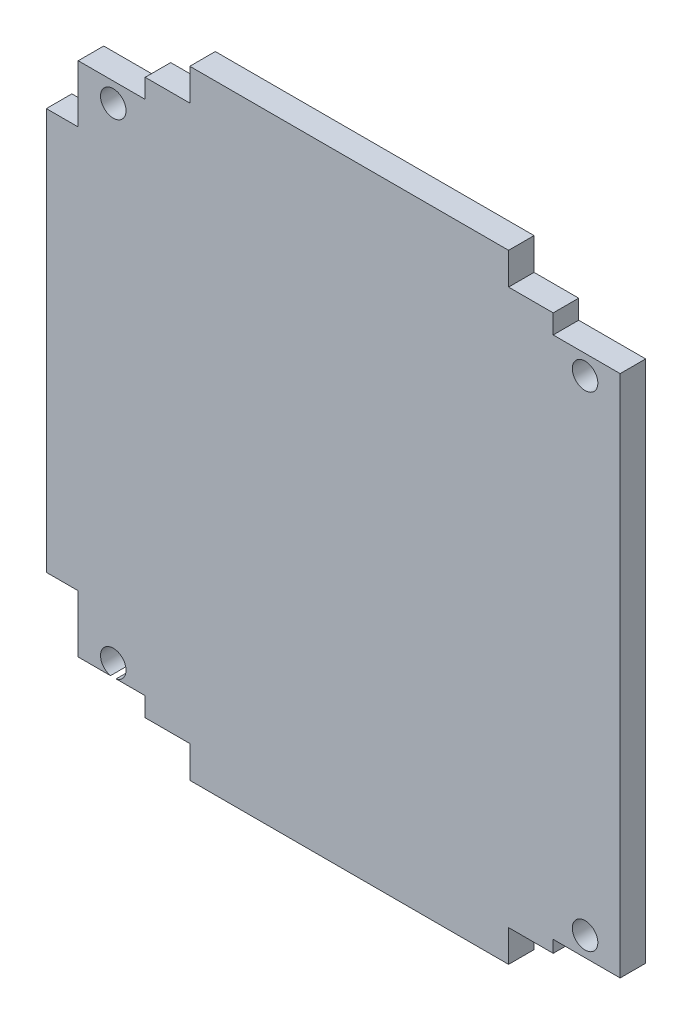
ISO-10303-21;
HEADER;
FILE_DESCRIPTION(('STEP AP214'),'2;1');
FILE_NAME('part.step','',(''),(''),'','','');
FILE_SCHEMA(('AUTOMOTIVE_DESIGN { 1 0 10303 214 1 1 1 1 }'));
ENDSEC;
DATA;
#1=APPLICATION_CONTEXT('core data for automotive mechanical design processes');
#2=APPLICATION_PROTOCOL_DEFINITION('international standard','automotive_design',2000,#1);
#3=PRODUCT_CONTEXT('',#1,'mechanical');
#4=PRODUCT('Part','Part','',(#3));
#5=PRODUCT_RELATED_PRODUCT_CATEGORY('part','',(#4));
#6=PRODUCT_DEFINITION_FORMATION('','',#4);
#7=PRODUCT_DEFINITION_CONTEXT('part definition',#1,'design');
#8=PRODUCT_DEFINITION('design','',#6,#7);
#9=PRODUCT_DEFINITION_SHAPE('','',#8);
#10=(LENGTH_UNIT() NAMED_UNIT(*) SI_UNIT(.MILLI.,.METRE.));
#11=(NAMED_UNIT(*) PLANE_ANGLE_UNIT() SI_UNIT($,.RADIAN.));
#12=(NAMED_UNIT(*) SI_UNIT($,.STERADIAN.) SOLID_ANGLE_UNIT());
#13=UNCERTAINTY_MEASURE_WITH_UNIT(LENGTH_MEASURE(1.E-05),#10,'distance_accuracy_value','');
#14=(GEOMETRIC_REPRESENTATION_CONTEXT(3) GLOBAL_UNCERTAINTY_ASSIGNED_CONTEXT((#13)) GLOBAL_UNIT_ASSIGNED_CONTEXT((#10,
#11,#12)) REPRESENTATION_CONTEXT('',''));
#15=CARTESIAN_POINT('',(0.,0.,0.));
#16=DIRECTION('',(0.,0.,1.));
#17=DIRECTION('',(1.,0.,0.));
#18=AXIS2_PLACEMENT_3D('',#15,#16,#17);
#19=CARTESIAN_POINT('',(-42.5,-39.9510102661599,4.));
#20=DIRECTION('',(0.,1.,0.));
#21=DIRECTION('',(0.,0.,1.));
#22=AXIS2_PLACEMENT_3D('',#19,#20,#21);
#23=PLANE('',#22);
#24=DIRECTION('',(1.,0.,0.));
#25=VECTOR('',#24,1.);
#26=CARTESIAN_POINT('',(-42.5,-39.9510102661599,0.));
#27=LINE('',#26,#25);
#28=CARTESIAN_POINT('',(-42.5,-39.9510102661599,0.));
#29=VERTEX_POINT('',#28);
#30=CARTESIAN_POINT('',(-37.4399268037023,-39.9510102661599,0.));
#31=VERTEX_POINT('',#30);
#32=EDGE_CURVE('E275',#29,#31,#27,.T.);
#33=ORIENTED_EDGE('',*,*,#32,.T.);
#34=DIRECTION('',(0.,0.,1.));
#35=VECTOR('',#34,1.);
#36=CARTESIAN_POINT('',(-37.4399268037023,-39.9510102661599,-6.));
#37=LINE('',#36,#35);
#38=CARTESIAN_POINT('',(-37.4399268037023,-39.9510102661599,4.));
#39=VERTEX_POINT('',#38);
#40=EDGE_CURVE('E54',#31,#39,#37,.T.);
#41=ORIENTED_EDGE('',*,*,#40,.T.);
#42=DIRECTION('',(1.,0.,0.));
#43=VECTOR('',#42,1.);
#44=CARTESIAN_POINT('',(-42.5,-39.9510102661599,4.));
#45=LINE('',#44,#43);
#46=CARTESIAN_POINT('',(-42.5,-39.9510102661599,4.));
#47=VERTEX_POINT('',#46);
#48=EDGE_CURVE('E402',#47,#39,#45,.T.);
#49=ORIENTED_EDGE('',*,*,#48,.F.);
#50=DIRECTION('',(0.,0.,-1.));
#51=VECTOR('',#50,1.);
#52=CARTESIAN_POINT('',(-42.5,-39.9510102661599,4.));
#53=LINE('',#52,#51);
#54=EDGE_CURVE('E316',#47,#29,#53,.T.);
#55=ORIENTED_EDGE('',*,*,#54,.T.);
#56=EDGE_LOOP('',(#33,#41,#49,#55));
#57=FACE_BOUND('',#56,.T.);
#58=ADVANCED_FACE('F39',(#57),#23,.F.);
#59=CARTESIAN_POINT('',(42.5,41.0489897338401,4.));
#60=DIRECTION('',(0.,-1.,0.));
#61=DIRECTION('',(1.,0.,0.));
#62=AXIS2_PLACEMENT_3D('',#59,#60,#61);
#63=PLANE('',#62);
#64=DIRECTION('',(-1.,0.,0.));
#65=VECTOR('',#64,1.);
#66=CARTESIAN_POINT('',(42.5,41.0489897338401,0.));
#67=LINE('',#66,#65);
#68=CARTESIAN_POINT('',(42.5,41.0489897338401,0.));
#69=VERTEX_POINT('',#68);
#70=CARTESIAN_POINT('',(32.,41.0489897338401,0.));
#71=VERTEX_POINT('',#70);
#72=EDGE_CURVE('E245',#69,#71,#67,.T.);
#73=ORIENTED_EDGE('',*,*,#72,.T.);
#74=DIRECTION('',(0.,0.,-1.));
#75=VECTOR('',#74,1.);
#76=CARTESIAN_POINT('',(32.,41.0489897338401,4.));
#77=LINE('',#76,#75);
#78=CARTESIAN_POINT('',(32.,41.0489897338401,4.));
#79=VERTEX_POINT('',#78);
#80=EDGE_CURVE('E48',#79,#71,#77,.T.);
#81=ORIENTED_EDGE('',*,*,#80,.F.);
#82=DIRECTION('',(-1.,0.,0.));
#83=VECTOR('',#82,1.);
#84=CARTESIAN_POINT('',(42.5,41.0489897338401,4.));
#85=LINE('',#84,#83);
#86=CARTESIAN_POINT('',(42.5,41.0489897338401,4.));
#87=VERTEX_POINT('',#86);
#88=EDGE_CURVE('E294',#87,#79,#85,.T.);
#89=ORIENTED_EDGE('',*,*,#88,.F.);
#90=DIRECTION('',(0.,0.,-1.));
#91=VECTOR('',#90,1.);
#92=CARTESIAN_POINT('',(42.5,41.0489897338401,4.));
#93=LINE('',#92,#91);
#94=EDGE_CURVE('E241',#87,#69,#93,.T.);
#95=ORIENTED_EDGE('',*,*,#94,.T.);
#96=EDGE_LOOP('',(#73,#81,#89,#95));
#97=FACE_BOUND('',#96,.T.);
#98=ADVANCED_FACE('F41',(#97),#63,.F.);
#99=CARTESIAN_POINT('',(32.,41.0489897338401,4.));
#100=DIRECTION('',(-1.,0.,0.));
#101=DIRECTION('',(0.,0.,1.));
#102=AXIS2_PLACEMENT_3D('',#99,#100,#101);
#103=PLANE('',#102);
#104=DIRECTION('',(0.,1.,0.));
#105=VECTOR('',#104,1.);
#106=CARTESIAN_POINT('',(32.,41.0489897338401,0.));
#107=LINE('',#106,#105);
#108=CARTESIAN_POINT('',(32.,44.0489897338401,0.));
#109=VERTEX_POINT('',#108);
#110=EDGE_CURVE('E248',#71,#109,#107,.T.);
#111=ORIENTED_EDGE('',*,*,#110,.T.);
#112=DIRECTION('',(0.,0.,-1.));
#113=VECTOR('',#112,1.);
#114=CARTESIAN_POINT('',(32.,44.0489897338401,4.));
#115=LINE('',#114,#113);
#116=CARTESIAN_POINT('',(32.,44.0489897338401,4.));
#117=VERTEX_POINT('',#116);
#118=EDGE_CURVE('E352',#117,#109,#115,.T.);
#119=ORIENTED_EDGE('',*,*,#118,.F.);
#120=DIRECTION('',(0.,1.,0.));
#121=VECTOR('',#120,1.);
#122=CARTESIAN_POINT('',(32.,41.0489897338401,4.));
#123=LINE('',#122,#121);
#124=EDGE_CURVE('E153',#79,#117,#123,.T.);
#125=ORIENTED_EDGE('',*,*,#124,.F.);
#126=ORIENTED_EDGE('',*,*,#80,.T.);
#127=EDGE_LOOP('',(#111,#119,#125,#126));
#128=FACE_BOUND('',#127,.T.);
#129=ADVANCED_FACE('F433',(#128),#103,.F.);
#130=CARTESIAN_POINT('',(25.,44.0489897338401,4.));
#131=DIRECTION('',(0.,-1.,0.));
#132=DIRECTION('',(1.,0.,0.));
#133=AXIS2_PLACEMENT_3D('',#130,#131,#132);
#134=PLANE('',#133);
#135=DIRECTION('',(-1.,0.,0.));
#136=VECTOR('',#135,1.);
#137=CARTESIAN_POINT('',(25.,44.0489897338401,0.));
#138=LINE('',#137,#136);
#139=CARTESIAN_POINT('',(25.,44.0489897338401,0.));
#140=VERTEX_POINT('',#139);
#141=EDGE_CURVE('E250',#109,#140,#138,.T.);
#142=ORIENTED_EDGE('',*,*,#141,.T.);
#143=DIRECTION('',(0.,0.,-1.));
#144=VECTOR('',#143,1.);
#145=CARTESIAN_POINT('',(25.,44.0489897338401,4.));
#146=LINE('',#145,#144);
#147=CARTESIAN_POINT('',(25.,44.0489897338401,4.));
#148=VERTEX_POINT('',#147);
#149=EDGE_CURVE('E349',#148,#140,#146,.T.);
#150=ORIENTED_EDGE('',*,*,#149,.F.);
#151=DIRECTION('',(-1.,0.,0.));
#152=VECTOR('',#151,1.);
#153=CARTESIAN_POINT('',(25.,44.0489897338401,4.));
#154=LINE('',#153,#152);
#155=EDGE_CURVE('E377',#117,#148,#154,.T.);
#156=ORIENTED_EDGE('',*,*,#155,.F.);
#157=ORIENTED_EDGE('',*,*,#118,.T.);
#158=EDGE_LOOP('',(#142,#150,#156,#157));
#159=FACE_BOUND('',#158,.T.);
#160=ADVANCED_FACE('F436',(#159),#134,.F.);
#161=CARTESIAN_POINT('',(25.,49.0489897338401,4.));
#162=DIRECTION('',(-1.,0.,0.));
#163=DIRECTION('',(0.,0.,1.));
#164=AXIS2_PLACEMENT_3D('',#161,#162,#163);
#165=PLANE('',#164);
#166=DIRECTION('',(0.,1.,0.));
#167=VECTOR('',#166,1.);
#168=CARTESIAN_POINT('',(25.,49.0489897338401,0.));
#169=LINE('',#168,#167);
#170=CARTESIAN_POINT('',(25.,49.0489897338401,0.));
#171=VERTEX_POINT('',#170);
#172=EDGE_CURVE('E252',#140,#171,#169,.T.);
#173=ORIENTED_EDGE('',*,*,#172,.T.);
#174=DIRECTION('',(0.,0.,-1.));
#175=VECTOR('',#174,1.);
#176=CARTESIAN_POINT('',(25.,49.0489897338401,4.));
#177=LINE('',#176,#175);
#178=CARTESIAN_POINT('',(25.,49.0489897338401,4.));
#179=VERTEX_POINT('',#178);
#180=EDGE_CURVE('E346',#179,#171,#177,.T.);
#181=ORIENTED_EDGE('',*,*,#180,.F.);
#182=DIRECTION('',(0.,1.,0.));
#183=VECTOR('',#182,1.);
#184=CARTESIAN_POINT('',(25.,49.0489897338401,4.));
#185=LINE('',#184,#183);
#186=EDGE_CURVE('E379',#148,#179,#185,.T.);
#187=ORIENTED_EDGE('',*,*,#186,.F.);
#188=ORIENTED_EDGE('',*,*,#149,.T.);
#189=EDGE_LOOP('',(#173,#181,#187,#188));
#190=FACE_BOUND('',#189,.T.);
#191=ADVANCED_FACE('F441',(#190),#165,.F.);
#192=CARTESIAN_POINT('',(-25.,49.0489897338401,4.));
#193=DIRECTION('',(0.,-1.,0.));
#194=DIRECTION('',(0.,0.,-1.));
#195=AXIS2_PLACEMENT_3D('',#192,#193,#194);
#196=PLANE('',#195);
#197=DIRECTION('',(-1.,0.,0.));
#198=VECTOR('',#197,1.);
#199=CARTESIAN_POINT('',(-25.,49.0489897338401,0.));
#200=LINE('',#199,#198);
#201=CARTESIAN_POINT('',(-25.,49.0489897338401,0.));
#202=VERTEX_POINT('',#201);
#203=EDGE_CURVE('E254',#171,#202,#200,.T.);
#204=ORIENTED_EDGE('',*,*,#203,.T.);
#205=DIRECTION('',(0.,0.,-1.));
#206=VECTOR('',#205,1.);
#207=CARTESIAN_POINT('',(-25.,49.0489897338401,4.));
#208=LINE('',#207,#206);
#209=CARTESIAN_POINT('',(-25.,49.0489897338401,4.));
#210=VERTEX_POINT('',#209);
#211=EDGE_CURVE('E343',#210,#202,#208,.T.);
#212=ORIENTED_EDGE('',*,*,#211,.F.);
#213=DIRECTION('',(-1.,0.,0.));
#214=VECTOR('',#213,1.);
#215=CARTESIAN_POINT('',(-25.,49.0489897338401,4.));
#216=LINE('',#215,#214);
#217=EDGE_CURVE('E381',#179,#210,#216,.T.);
#218=ORIENTED_EDGE('',*,*,#217,.F.);
#219=ORIENTED_EDGE('',*,*,#180,.T.);
#220=EDGE_LOOP('',(#204,#212,#218,#219));
#221=FACE_BOUND('',#220,.T.);
#222=ADVANCED_FACE('F447',(#221),#196,.F.);
#223=CARTESIAN_POINT('',(-25.,44.0489897338401,4.));
#224=DIRECTION('',(1.,0.,0.));
#225=DIRECTION('',(0.,0.,-1.));
#226=AXIS2_PLACEMENT_3D('',#223,#224,#225);
#227=PLANE('',#226);
#228=DIRECTION('',(0.,-1.,0.));
#229=VECTOR('',#228,1.);
#230=CARTESIAN_POINT('',(-25.,44.0489897338401,0.));
#231=LINE('',#230,#229);
#232=CARTESIAN_POINT('',(-25.,44.0489897338401,0.));
#233=VERTEX_POINT('',#232);
#234=EDGE_CURVE('E256',#202,#233,#231,.T.);
#235=ORIENTED_EDGE('',*,*,#234,.T.);
#236=DIRECTION('',(0.,0.,-1.));
#237=VECTOR('',#236,1.);
#238=CARTESIAN_POINT('',(-25.,44.0489897338401,4.));
#239=LINE('',#238,#237);
#240=CARTESIAN_POINT('',(-25.,44.0489897338401,4.));
#241=VERTEX_POINT('',#240);
#242=EDGE_CURVE('E340',#241,#233,#239,.T.);
#243=ORIENTED_EDGE('',*,*,#242,.F.);
#244=DIRECTION('',(0.,-1.,0.));
#245=VECTOR('',#244,1.);
#246=CARTESIAN_POINT('',(-25.,44.0489897338401,4.));
#247=LINE('',#246,#245);
#248=EDGE_CURVE('E383',#210,#241,#247,.T.);
#249=ORIENTED_EDGE('',*,*,#248,.F.);
#250=ORIENTED_EDGE('',*,*,#211,.T.);
#251=EDGE_LOOP('',(#235,#243,#249,#250));
#252=FACE_BOUND('',#251,.T.);
#253=ADVANCED_FACE('F451',(#252),#227,.F.);
#254=CARTESIAN_POINT('',(-32.,44.0489897338401,4.));
#255=DIRECTION('',(0.,-1.,0.));
#256=DIRECTION('',(0.,0.,-1.));
#257=AXIS2_PLACEMENT_3D('',#254,#255,#256);
#258=PLANE('',#257);
#259=DIRECTION('',(-1.,0.,0.));
#260=VECTOR('',#259,1.);
#261=CARTESIAN_POINT('',(-32.,44.0489897338401,0.));
#262=LINE('',#261,#260);
#263=CARTESIAN_POINT('',(-32.,44.0489897338401,0.));
#264=VERTEX_POINT('',#263);
#265=EDGE_CURVE('E258',#233,#264,#262,.T.);
#266=ORIENTED_EDGE('',*,*,#265,.T.);
#267=DIRECTION('',(0.,0.,-1.));
#268=VECTOR('',#267,1.);
#269=CARTESIAN_POINT('',(-32.,44.0489897338401,4.));
#270=LINE('',#269,#268);
#271=CARTESIAN_POINT('',(-32.,44.0489897338401,4.));
#272=VERTEX_POINT('',#271);
#273=EDGE_CURVE('E337',#272,#264,#270,.T.);
#274=ORIENTED_EDGE('',*,*,#273,.F.);
#275=DIRECTION('',(-1.,0.,0.));
#276=VECTOR('',#275,1.);
#277=CARTESIAN_POINT('',(-32.,44.0489897338401,4.));
#278=LINE('',#277,#276);
#279=EDGE_CURVE('E385',#241,#272,#278,.T.);
#280=ORIENTED_EDGE('',*,*,#279,.F.);
#281=ORIENTED_EDGE('',*,*,#242,.T.);
#282=EDGE_LOOP('',(#266,#274,#280,#281));
#283=FACE_BOUND('',#282,.T.);
#284=ADVANCED_FACE('F456',(#283),#258,.F.);
#285=CARTESIAN_POINT('',(-32.,41.0489897338401,4.));
#286=DIRECTION('',(1.,0.,0.));
#287=DIRECTION('',(0.,0.,-1.));
#288=AXIS2_PLACEMENT_3D('',#285,#286,#287);
#289=PLANE('',#288);
#290=DIRECTION('',(0.,-1.,0.));
#291=VECTOR('',#290,1.);
#292=CARTESIAN_POINT('',(-32.,41.0489897338401,0.));
#293=LINE('',#292,#291);
#294=CARTESIAN_POINT('',(-32.,41.0489897338401,0.));
#295=VERTEX_POINT('',#294);
#296=EDGE_CURVE('E260',#264,#295,#293,.T.);
#297=ORIENTED_EDGE('',*,*,#296,.T.);
#298=DIRECTION('',(0.,0.,-1.));
#299=VECTOR('',#298,1.);
#300=CARTESIAN_POINT('',(-32.,41.0489897338401,4.));
#301=LINE('',#300,#299);
#302=CARTESIAN_POINT('',(-32.,41.0489897338401,4.));
#303=VERTEX_POINT('',#302);
#304=EDGE_CURVE('E334',#303,#295,#301,.T.);
#305=ORIENTED_EDGE('',*,*,#304,.F.);
#306=DIRECTION('',(0.,-1.,0.));
#307=VECTOR('',#306,1.);
#308=CARTESIAN_POINT('',(-32.,41.0489897338401,4.));
#309=LINE('',#308,#307);
#310=EDGE_CURVE('E387',#272,#303,#309,.T.);
#311=ORIENTED_EDGE('',*,*,#310,.F.);
#312=ORIENTED_EDGE('',*,*,#273,.T.);
#313=EDGE_LOOP('',(#297,#305,#311,#312));
#314=FACE_BOUND('',#313,.T.);
#315=ADVANCED_FACE('F462',(#314),#289,.F.);
#316=CARTESIAN_POINT('',(-42.5,41.0489897338401,4.));
#317=DIRECTION('',(0.,-1.,0.));
#318=DIRECTION('',(0.,0.,-1.));
#319=AXIS2_PLACEMENT_3D('',#316,#317,#318);
#320=PLANE('',#319);
#321=DIRECTION('',(-1.,0.,0.));
#322=VECTOR('',#321,1.);
#323=CARTESIAN_POINT('',(-42.5,41.0489897338401,0.));
#324=LINE('',#323,#322);
#325=CARTESIAN_POINT('',(-42.5,41.0489897338401,0.));
#326=VERTEX_POINT('',#325);
#327=EDGE_CURVE('E262',#295,#326,#324,.T.);
#328=ORIENTED_EDGE('',*,*,#327,.T.);
#329=DIRECTION('',(0.,0.,-1.));
#330=VECTOR('',#329,1.);
#331=CARTESIAN_POINT('',(-42.5,41.0489897338401,4.));
#332=LINE('',#331,#330);
#333=CARTESIAN_POINT('',(-42.5,41.0489897338401,4.));
#334=VERTEX_POINT('',#333);
#335=EDGE_CURVE('E331',#334,#326,#332,.T.);
#336=ORIENTED_EDGE('',*,*,#335,.F.);
#337=DIRECTION('',(-1.,0.,0.));
#338=VECTOR('',#337,1.);
#339=CARTESIAN_POINT('',(-42.5,41.0489897338401,4.));
#340=LINE('',#339,#338);
#341=EDGE_CURVE('E389',#303,#334,#340,.T.);
#342=ORIENTED_EDGE('',*,*,#341,.F.);
#343=ORIENTED_EDGE('',*,*,#304,.T.);
#344=EDGE_LOOP('',(#328,#336,#342,#343));
#345=FACE_BOUND('',#344,.T.);
#346=ADVANCED_FACE('F466',(#345),#320,.F.);
#347=CARTESIAN_POINT('',(-42.5,32.0489897338401,4.));
#348=DIRECTION('',(1.,0.,0.));
#349=DIRECTION('',(0.,1.,0.));
#350=AXIS2_PLACEMENT_3D('',#347,#348,#349);
#351=PLANE('',#350);
#352=DIRECTION('',(0.,-1.,0.));
#353=VECTOR('',#352,1.);
#354=CARTESIAN_POINT('',(-42.5,32.0489897338401,0.));
#355=LINE('',#354,#353);
#356=CARTESIAN_POINT('',(-42.5,32.0489897338401,0.));
#357=VERTEX_POINT('',#356);
#358=EDGE_CURVE('E264',#326,#357,#355,.T.);
#359=ORIENTED_EDGE('',*,*,#358,.T.);
#360=DIRECTION('',(0.,0.,-1.));
#361=VECTOR('',#360,1.);
#362=CARTESIAN_POINT('',(-42.5,32.0489897338401,4.));
#363=LINE('',#362,#361);
#364=CARTESIAN_POINT('',(-42.5,32.0489897338401,4.));
#365=VERTEX_POINT('',#364);
#366=EDGE_CURVE('E328',#365,#357,#363,.T.);
#367=ORIENTED_EDGE('',*,*,#366,.F.);
#368=DIRECTION('',(0.,-1.,0.));
#369=VECTOR('',#368,1.);
#370=CARTESIAN_POINT('',(-42.5,32.0489897338401,4.));
#371=LINE('',#370,#369);
#372=EDGE_CURVE('E391',#334,#365,#371,.T.);
#373=ORIENTED_EDGE('',*,*,#372,.F.);
#374=ORIENTED_EDGE('',*,*,#335,.T.);
#375=EDGE_LOOP('',(#359,#367,#373,#374));
#376=FACE_BOUND('',#375,.T.);
#377=ADVANCED_FACE('F471',(#376),#351,.F.);
#378=CARTESIAN_POINT('',(-47.5,32.0489897338401,4.));
#379=DIRECTION('',(0.,-1.,0.));
#380=DIRECTION('',(0.,0.,-1.));
#381=AXIS2_PLACEMENT_3D('',#378,#379,#380);
#382=PLANE('',#381);
#383=DIRECTION('',(-1.,0.,0.));
#384=VECTOR('',#383,1.);
#385=CARTESIAN_POINT('',(-47.5,32.0489897338401,0.));
#386=LINE('',#385,#384);
#387=CARTESIAN_POINT('',(-47.5,32.0489897338401,0.));
#388=VERTEX_POINT('',#387);
#389=EDGE_CURVE('E266',#357,#388,#386,.T.);
#390=ORIENTED_EDGE('',*,*,#389,.T.);
#391=DIRECTION('',(0.,0.,-1.));
#392=VECTOR('',#391,1.);
#393=CARTESIAN_POINT('',(-47.5,32.0489897338401,4.));
#394=LINE('',#393,#392);
#395=CARTESIAN_POINT('',(-47.5,32.0489897338401,4.));
#396=VERTEX_POINT('',#395);
#397=EDGE_CURVE('E325',#396,#388,#394,.T.);
#398=ORIENTED_EDGE('',*,*,#397,.F.);
#399=DIRECTION('',(-1.,0.,0.));
#400=VECTOR('',#399,1.);
#401=CARTESIAN_POINT('',(-47.5,32.0489897338401,4.));
#402=LINE('',#401,#400);
#403=EDGE_CURVE('E393',#365,#396,#402,.T.);
#404=ORIENTED_EDGE('',*,*,#403,.F.);
#405=ORIENTED_EDGE('',*,*,#366,.T.);
#406=EDGE_LOOP('',(#390,#398,#404,#405));
#407=FACE_BOUND('',#406,.T.);
#408=ADVANCED_FACE('F477',(#407),#382,.F.);
#409=CARTESIAN_POINT('',(-47.5,32.0489897338401,4.));
#410=DIRECTION('',(1.,0.,0.));
#411=DIRECTION('',(0.,1.,0.));
#412=AXIS2_PLACEMENT_3D('',#409,#410,#411);
#413=PLANE('',#412);
#414=DIRECTION('',(0.,-1.,0.));
#415=VECTOR('',#414,1.);
#416=CARTESIAN_POINT('',(-47.5,32.0489897338401,0.));
#417=LINE('',#416,#415);
#418=CARTESIAN_POINT('',(-47.5,-30.9510102661599,0.));
#419=VERTEX_POINT('',#418);
#420=EDGE_CURVE('E268',#388,#419,#417,.T.);
#421=ORIENTED_EDGE('',*,*,#420,.T.);
#422=DIRECTION('',(0.,0.,-1.));
#423=VECTOR('',#422,1.);
#424=CARTESIAN_POINT('',(-47.5,-30.9510102661599,4.));
#425=LINE('',#424,#423);
#426=CARTESIAN_POINT('',(-47.5,-30.9510102661599,4.));
#427=VERTEX_POINT('',#426);
#428=EDGE_CURVE('E322',#427,#419,#425,.T.);
#429=ORIENTED_EDGE('',*,*,#428,.F.);
#430=DIRECTION('',(0.,-1.,0.));
#431=VECTOR('',#430,1.);
#432=CARTESIAN_POINT('',(-47.5,32.0489897338401,4.));
#433=LINE('',#432,#431);
#434=EDGE_CURVE('E395',#396,#427,#433,.T.);
#435=ORIENTED_EDGE('',*,*,#434,.F.);
#436=ORIENTED_EDGE('',*,*,#397,.T.);
#437=EDGE_LOOP('',(#421,#429,#435,#436));
#438=FACE_BOUND('',#437,.T.);
#439=ADVANCED_FACE('F481',(#438),#413,.F.);
#440=CARTESIAN_POINT('',(-47.5,-30.9510102661599,4.));
#441=DIRECTION('',(0.,1.,0.));
#442=DIRECTION('',(0.,0.,1.));
#443=AXIS2_PLACEMENT_3D('',#440,#441,#442);
#444=PLANE('',#443);
#445=DIRECTION('',(1.,0.,0.));
#446=VECTOR('',#445,1.);
#447=CARTESIAN_POINT('',(-47.5,-30.9510102661599,0.));
#448=LINE('',#447,#446);
#449=CARTESIAN_POINT('',(-42.5,-30.9510102661599,0.));
#450=VERTEX_POINT('',#449);
#451=EDGE_CURVE('E270',#419,#450,#448,.T.);
#452=ORIENTED_EDGE('',*,*,#451,.T.);
#453=DIRECTION('',(0.,0.,-1.));
#454=VECTOR('',#453,1.);
#455=CARTESIAN_POINT('',(-42.5,-30.9510102661599,4.));
#456=LINE('',#455,#454);
#457=CARTESIAN_POINT('',(-42.5,-30.9510102661599,4.));
#458=VERTEX_POINT('',#457);
#459=EDGE_CURVE('E319',#458,#450,#456,.T.);
#460=ORIENTED_EDGE('',*,*,#459,.F.);
#461=DIRECTION('',(1.,0.,0.));
#462=VECTOR('',#461,1.);
#463=CARTESIAN_POINT('',(-47.5,-30.9510102661599,4.));
#464=LINE('',#463,#462);
#465=EDGE_CURVE('E397',#427,#458,#464,.T.);
#466=ORIENTED_EDGE('',*,*,#465,.F.);
#467=ORIENTED_EDGE('',*,*,#428,.T.);
#468=EDGE_LOOP('',(#452,#460,#466,#467));
#469=FACE_BOUND('',#468,.T.);
#470=ADVANCED_FACE('F486',(#469),#444,.F.);
#471=CARTESIAN_POINT('',(-42.5,-39.9510102661599,4.));
#472=DIRECTION('',(1.,0.,0.));
#473=DIRECTION('',(0.,0.,-1.));
#474=AXIS2_PLACEMENT_3D('',#471,#472,#473);
#475=PLANE('',#474);
#476=DIRECTION('',(0.,-1.,0.));
#477=VECTOR('',#476,1.);
#478=CARTESIAN_POINT('',(-42.5,-39.9510102661599,0.));
#479=LINE('',#478,#477);
#480=EDGE_CURVE('E272',#450,#29,#479,.T.);
#481=ORIENTED_EDGE('',*,*,#480,.T.);
#482=ORIENTED_EDGE('',*,*,#54,.F.);
#483=DIRECTION('',(0.,-1.,0.));
#484=VECTOR('',#483,1.);
#485=CARTESIAN_POINT('',(-42.5,-39.9510102661599,4.));
#486=LINE('',#485,#484);
#487=EDGE_CURVE('E399',#458,#47,#486,.T.);
#488=ORIENTED_EDGE('',*,*,#487,.F.);
#489=ORIENTED_EDGE('',*,*,#459,.T.);
#490=EDGE_LOOP('',(#481,#482,#488,#489));
#491=FACE_BOUND('',#490,.T.);
#492=ADVANCED_FACE('F493',(#491),#475,.F.);
#493=CARTESIAN_POINT('',(-36.5600201241895,-39.9510102661599,4.));
#494=VERTEX_POINT('',#493);
#495=CARTESIAN_POINT('',(-32.,-39.9510102661599,4.));
#496=VERTEX_POINT('',#495);
#497=EDGE_CURVE('E401',#494,#496,#45,.T.);
#498=ORIENTED_EDGE('',*,*,#497,.F.);
#499=DIRECTION('',(0.,0.,1.));
#500=VECTOR('',#499,1.);
#501=CARTESIAN_POINT('',(-36.5600201241895,-39.9510102661599,-6.));
#502=LINE('',#501,#500);
#503=CARTESIAN_POINT('',(-36.5600201241895,-39.9510102661599,0.));
#504=VERTEX_POINT('',#503);
#505=EDGE_CURVE('E362',#494,#504,#502,.F.);
#506=ORIENTED_EDGE('',*,*,#505,.T.);
#507=CARTESIAN_POINT('',(-32.,-39.9510102661599,0.));
#508=VERTEX_POINT('',#507);
#509=EDGE_CURVE('E274',#504,#508,#27,.T.);
#510=ORIENTED_EDGE('',*,*,#509,.T.);
#511=DIRECTION('',(0.,0.,-1.));
#512=VECTOR('',#511,1.);
#513=CARTESIAN_POINT('',(-32.,-39.9510102661599,4.));
#514=LINE('',#513,#512);
#515=EDGE_CURVE('E313',#496,#508,#514,.T.);
#516=ORIENTED_EDGE('',*,*,#515,.F.);
#517=EDGE_LOOP('',(#498,#506,#510,#516));
#518=FACE_BOUND('',#517,.T.);
#519=ADVANCED_FACE('F504',(#518),#23,.F.);
#520=CARTESIAN_POINT('',(-32.,-39.9510102661599,4.));
#521=DIRECTION('',(1.,0.,0.));
#522=DIRECTION('',(0.,0.,-1.));
#523=AXIS2_PLACEMENT_3D('',#520,#521,#522);
#524=PLANE('',#523);
#525=DIRECTION('',(0.,-1.,0.));
#526=VECTOR('',#525,1.);
#527=CARTESIAN_POINT('',(-32.,-39.9510102661599,0.));
#528=LINE('',#527,#526);
#529=CARTESIAN_POINT('',(-32.,-42.9510102661599,0.));
#530=VERTEX_POINT('',#529);
#531=EDGE_CURVE('E278',#508,#530,#528,.T.);
#532=ORIENTED_EDGE('',*,*,#531,.T.);
#533=DIRECTION('',(0.,0.,-1.));
#534=VECTOR('',#533,1.);
#535=CARTESIAN_POINT('',(-32.,-42.9510102661599,4.));
#536=LINE('',#535,#534);
#537=CARTESIAN_POINT('',(-32.,-42.9510102661599,4.));
#538=VERTEX_POINT('',#537);
#539=EDGE_CURVE('E310',#538,#530,#536,.T.);
#540=ORIENTED_EDGE('',*,*,#539,.F.);
#541=DIRECTION('',(0.,-1.,0.));
#542=VECTOR('',#541,1.);
#543=CARTESIAN_POINT('',(-32.,-39.9510102661599,4.));
#544=LINE('',#543,#542);
#545=EDGE_CURVE('E404',#496,#538,#544,.T.);
#546=ORIENTED_EDGE('',*,*,#545,.F.);
#547=ORIENTED_EDGE('',*,*,#515,.T.);
#548=EDGE_LOOP('',(#532,#540,#546,#547));
#549=FACE_BOUND('',#548,.T.);
#550=ADVANCED_FACE('F507',(#549),#524,.F.);
#551=CARTESIAN_POINT('',(-32.,-42.9510102661599,4.));
#552=DIRECTION('',(0.,1.,0.));
#553=DIRECTION('',(0.,0.,1.));
#554=AXIS2_PLACEMENT_3D('',#551,#552,#553);
#555=PLANE('',#554);
#556=DIRECTION('',(1.,0.,0.));
#557=VECTOR('',#556,1.);
#558=CARTESIAN_POINT('',(-32.,-42.9510102661599,0.));
#559=LINE('',#558,#557);
#560=CARTESIAN_POINT('',(-25.,-42.9510102661599,0.));
#561=VERTEX_POINT('',#560);
#562=EDGE_CURVE('E280',#530,#561,#559,.T.);
#563=ORIENTED_EDGE('',*,*,#562,.T.);
#564=DIRECTION('',(0.,0.,-1.));
#565=VECTOR('',#564,1.);
#566=CARTESIAN_POINT('',(-25.,-42.9510102661599,4.));
#567=LINE('',#566,#565);
#568=CARTESIAN_POINT('',(-25.,-42.9510102661599,4.));
#569=VERTEX_POINT('',#568);
#570=EDGE_CURVE('E307',#569,#561,#567,.T.);
#571=ORIENTED_EDGE('',*,*,#570,.F.);
#572=DIRECTION('',(1.,0.,0.));
#573=VECTOR('',#572,1.);
#574=CARTESIAN_POINT('',(-32.,-42.9510102661599,4.));
#575=LINE('',#574,#573);
#576=EDGE_CURVE('E406',#538,#569,#575,.T.);
#577=ORIENTED_EDGE('',*,*,#576,.F.);
#578=ORIENTED_EDGE('',*,*,#539,.T.);
#579=EDGE_LOOP('',(#563,#571,#577,#578));
#580=FACE_BOUND('',#579,.T.);
#581=ADVANCED_FACE('F552',(#580),#555,.F.);
#582=CARTESIAN_POINT('',(-25.,-42.9510102661599,4.));
#583=DIRECTION('',(1.,0.,0.));
#584=DIRECTION('',(0.,0.,-1.));
#585=AXIS2_PLACEMENT_3D('',#582,#583,#584);
#586=PLANE('',#585);
#587=DIRECTION('',(0.,-1.,0.));
#588=VECTOR('',#587,1.);
#589=CARTESIAN_POINT('',(-25.,-42.9510102661599,0.));
#590=LINE('',#589,#588);
#591=CARTESIAN_POINT('',(-25.,-47.9510102661599,0.));
#592=VERTEX_POINT('',#591);
#593=EDGE_CURVE('E282',#561,#592,#590,.T.);
#594=ORIENTED_EDGE('',*,*,#593,.T.);
#595=DIRECTION('',(0.,0.,-1.));
#596=VECTOR('',#595,1.);
#597=CARTESIAN_POINT('',(-25.,-47.9510102661599,4.));
#598=LINE('',#597,#596);
#599=CARTESIAN_POINT('',(-25.,-47.9510102661599,4.));
#600=VERTEX_POINT('',#599);
#601=EDGE_CURVE('E304',#600,#592,#598,.T.);
#602=ORIENTED_EDGE('',*,*,#601,.F.);
#603=DIRECTION('',(0.,-1.,0.));
#604=VECTOR('',#603,1.);
#605=CARTESIAN_POINT('',(-25.,-42.9510102661599,4.));
#606=LINE('',#605,#604);
#607=EDGE_CURVE('E408',#569,#600,#606,.T.);
#608=ORIENTED_EDGE('',*,*,#607,.F.);
#609=ORIENTED_EDGE('',*,*,#570,.T.);
#610=EDGE_LOOP('',(#594,#602,#608,#609));
#611=FACE_BOUND('',#610,.T.);
#612=ADVANCED_FACE('F662',(#611),#586,.F.);
#613=CARTESIAN_POINT('',(-25.,-47.9510102661599,4.));
#614=DIRECTION('',(0.,1.,0.));
#615=DIRECTION('',(0.,0.,1.));
#616=AXIS2_PLACEMENT_3D('',#613,#614,#615);
#617=PLANE('',#616);
#618=DIRECTION('',(1.,0.,0.));
#619=VECTOR('',#618,1.);
#620=CARTESIAN_POINT('',(-25.,-47.9510102661599,0.));
#621=LINE('',#620,#619);
#622=CARTESIAN_POINT('',(25.,-47.9510102661599,0.));
#623=VERTEX_POINT('',#622);
#624=EDGE_CURVE('E284',#592,#623,#621,.T.);
#625=ORIENTED_EDGE('',*,*,#624,.T.);
#626=DIRECTION('',(0.,0.,-1.));
#627=VECTOR('',#626,1.);
#628=CARTESIAN_POINT('',(25.,-47.9510102661599,4.));
#629=LINE('',#628,#627);
#630=CARTESIAN_POINT('',(25.,-47.9510102661599,4.));
#631=VERTEX_POINT('',#630);
#632=EDGE_CURVE('E301',#631,#623,#629,.T.);
#633=ORIENTED_EDGE('',*,*,#632,.F.);
#634=DIRECTION('',(1.,0.,0.));
#635=VECTOR('',#634,1.);
#636=CARTESIAN_POINT('',(-25.,-47.9510102661599,4.));
#637=LINE('',#636,#635);
#638=EDGE_CURVE('E410',#600,#631,#637,.T.);
#639=ORIENTED_EDGE('',*,*,#638,.F.);
#640=ORIENTED_EDGE('',*,*,#601,.T.);
#641=EDGE_LOOP('',(#625,#633,#639,#640));
#642=FACE_BOUND('',#641,.T.);
#643=ADVANCED_FACE('F672',(#642),#617,.F.);
#644=CARTESIAN_POINT('',(25.,-47.9510102661599,4.));
#645=DIRECTION('',(-1.,0.,0.));
#646=DIRECTION('',(0.,0.,1.));
#647=AXIS2_PLACEMENT_3D('',#644,#645,#646);
#648=PLANE('',#647);
#649=DIRECTION('',(0.,1.,0.));
#650=VECTOR('',#649,1.);
#651=CARTESIAN_POINT('',(25.,-47.9510102661599,0.));
#652=LINE('',#651,#650);
#653=CARTESIAN_POINT('',(25.,-42.9510102661599,0.));
#654=VERTEX_POINT('',#653);
#655=EDGE_CURVE('E286',#623,#654,#652,.T.);
#656=ORIENTED_EDGE('',*,*,#655,.T.);
#657=DIRECTION('',(0.,0.,-1.));
#658=VECTOR('',#657,1.);
#659=CARTESIAN_POINT('',(25.,-42.9510102661599,4.));
#660=LINE('',#659,#658);
#661=CARTESIAN_POINT('',(25.,-42.9510102661599,4.));
#662=VERTEX_POINT('',#661);
#663=EDGE_CURVE('E298',#662,#654,#660,.T.);
#664=ORIENTED_EDGE('',*,*,#663,.F.);
#665=DIRECTION('',(0.,1.,0.));
#666=VECTOR('',#665,1.);
#667=CARTESIAN_POINT('',(25.,-47.9510102661599,4.));
#668=LINE('',#667,#666);
#669=EDGE_CURVE('E412',#631,#662,#668,.T.);
#670=ORIENTED_EDGE('',*,*,#669,.F.);
#671=ORIENTED_EDGE('',*,*,#632,.T.);
#672=EDGE_LOOP('',(#656,#664,#670,#671));
#673=FACE_BOUND('',#672,.T.);
#674=ADVANCED_FACE('F418',(#673),#648,.F.);
#675=CARTESIAN_POINT('',(25.,-42.9510102661599,4.));
#676=DIRECTION('',(0.,1.,0.));
#677=DIRECTION('',(0.,0.,1.));
#678=AXIS2_PLACEMENT_3D('',#675,#676,#677);
#679=PLANE('',#678);
#680=DIRECTION('',(1.,0.,0.));
#681=VECTOR('',#680,1.);
#682=CARTESIAN_POINT('',(25.,-42.9510102661599,0.));
#683=LINE('',#682,#681);
#684=CARTESIAN_POINT('',(32.,-42.9510102661599,0.));
#685=VERTEX_POINT('',#684);
#686=EDGE_CURVE('E288',#654,#685,#683,.T.);
#687=ORIENTED_EDGE('',*,*,#686,.T.);
#688=DIRECTION('',(0.,0.,-1.));
#689=VECTOR('',#688,1.);
#690=CARTESIAN_POINT('',(32.,-42.9510102661599,4.));
#691=LINE('',#690,#689);
#692=CARTESIAN_POINT('',(32.,-42.9510102661599,4.));
#693=VERTEX_POINT('',#692);
#694=EDGE_CURVE('E236',#693,#685,#691,.T.);
#695=ORIENTED_EDGE('',*,*,#694,.F.);
#696=DIRECTION('',(1.,0.,0.));
#697=VECTOR('',#696,1.);
#698=CARTESIAN_POINT('',(25.,-42.9510102661599,4.));
#699=LINE('',#698,#697);
#700=EDGE_CURVE('E224',#662,#693,#699,.T.);
#701=ORIENTED_EDGE('',*,*,#700,.F.);
#702=ORIENTED_EDGE('',*,*,#663,.T.);
#703=EDGE_LOOP('',(#687,#695,#701,#702));
#704=FACE_BOUND('',#703,.T.);
#705=ADVANCED_FACE('F422',(#704),#679,.F.);
#706=CARTESIAN_POINT('',(32.,-41.0489897338401,4.));
#707=DIRECTION('',(-1.,0.,0.));
#708=DIRECTION('',(0.,0.,1.));
#709=AXIS2_PLACEMENT_3D('',#706,#707,#708);
#710=PLANE('',#709);
#711=DIRECTION('',(0.,1.,0.));
#712=VECTOR('',#711,1.);
#713=CARTESIAN_POINT('',(32.,-41.0489897338401,0.));
#714=LINE('',#713,#712);
#715=CARTESIAN_POINT('',(32.,-41.0489897338401,0.));
#716=VERTEX_POINT('',#715);
#717=EDGE_CURVE('E233',#685,#716,#714,.T.);
#718=ORIENTED_EDGE('',*,*,#717,.T.);
#719=DIRECTION('',(0.,0.,-1.));
#720=VECTOR('',#719,1.);
#721=CARTESIAN_POINT('',(32.,-41.0489897338401,4.));
#722=LINE('',#721,#720);
#723=CARTESIAN_POINT('',(32.,-41.0489897338401,4.));
#724=VERTEX_POINT('',#723);
#725=EDGE_CURVE('E230',#724,#716,#722,.T.);
#726=ORIENTED_EDGE('',*,*,#725,.F.);
#727=DIRECTION('',(0.,1.,0.));
#728=VECTOR('',#727,1.);
#729=CARTESIAN_POINT('',(32.,-41.0489897338401,4.));
#730=LINE('',#729,#728);
#731=EDGE_CURVE('E216',#693,#724,#730,.T.);
#732=ORIENTED_EDGE('',*,*,#731,.F.);
#733=ORIENTED_EDGE('',*,*,#694,.T.);
#734=EDGE_LOOP('',(#718,#726,#732,#733));
#735=FACE_BOUND('',#734,.T.);
#736=ADVANCED_FACE('F231',(#735),#710,.F.);
#737=CARTESIAN_POINT('',(42.5,-41.0489897338401,4.));
#738=DIRECTION('',(0.,1.,0.));
#739=DIRECTION('',(0.,0.,1.));
#740=AXIS2_PLACEMENT_3D('',#737,#738,#739);
#741=PLANE('',#740);
#742=DIRECTION('',(1.,0.,0.));
#743=VECTOR('',#742,1.);
#744=CARTESIAN_POINT('',(42.5,-41.0489897338401,0.));
#745=LINE('',#744,#743);
#746=CARTESIAN_POINT('',(42.5,-41.0489897338401,0.));
#747=VERTEX_POINT('',#746);
#748=EDGE_CURVE('E291',#716,#747,#745,.T.);
#749=ORIENTED_EDGE('',*,*,#748,.T.);
#750=DIRECTION('',(0.,0.,-1.));
#751=VECTOR('',#750,1.);
#752=CARTESIAN_POINT('',(42.5,-41.0489897338401,4.));
#753=LINE('',#752,#751);
#754=CARTESIAN_POINT('',(42.5,-41.0489897338401,4.));
#755=VERTEX_POINT('',#754);
#756=EDGE_CURVE('E237',#755,#747,#753,.T.);
#757=ORIENTED_EDGE('',*,*,#756,.F.);
#758=DIRECTION('',(1.,0.,0.));
#759=VECTOR('',#758,1.);
#760=CARTESIAN_POINT('',(42.5,-41.0489897338401,4.));
#761=LINE('',#760,#759);
#762=EDGE_CURVE('E221',#724,#755,#761,.T.);
#763=ORIENTED_EDGE('',*,*,#762,.F.);
#764=ORIENTED_EDGE('',*,*,#725,.T.);
#765=EDGE_LOOP('',(#749,#757,#763,#764));
#766=FACE_BOUND('',#765,.T.);
#767=ADVANCED_FACE('F239',(#766),#741,.F.);
#768=CARTESIAN_POINT('',(42.5,-41.0489897338401,4.));
#769=DIRECTION('',(-1.,0.,0.));
#770=DIRECTION('',(0.,0.,1.));
#771=AXIS2_PLACEMENT_3D('',#768,#769,#770);
#772=PLANE('',#771);
#773=DIRECTION('',(0.,1.,0.));
#774=VECTOR('',#773,1.);
#775=CARTESIAN_POINT('',(42.5,-41.0489897338401,0.));
#776=LINE('',#775,#774);
#777=EDGE_CURVE('E144',#747,#69,#776,.T.);
#778=ORIENTED_EDGE('',*,*,#777,.T.);
#779=ORIENTED_EDGE('',*,*,#94,.F.);
#780=DIRECTION('',(0.,1.,0.));
#781=VECTOR('',#780,1.);
#782=CARTESIAN_POINT('',(42.5,-41.0489897338401,4.));
#783=LINE('',#782,#781);
#784=EDGE_CURVE('E63',#755,#87,#783,.T.);
#785=ORIENTED_EDGE('',*,*,#784,.F.);
#786=ORIENTED_EDGE('',*,*,#756,.T.);
#787=EDGE_LOOP('',(#778,#779,#785,#786));
#788=FACE_BOUND('',#787,.T.);
#789=ADVANCED_FACE('F427',(#788),#772,.F.);
#790=CARTESIAN_POINT('',(0.,0.,4.));
#791=DIRECTION('',(0.,0.,-1.));
#792=DIRECTION('',(-1.,0.,0.));
#793=AXIS2_PLACEMENT_3D('',#790,#791,#792);
#794=PLANE('',#793);
#795=CARTESIAN_POINT('',(36.9999734638412,38.0000000000391,4.));
#796=DIRECTION('',(0.,0.,1.));
#797=DIRECTION('',(1.,0.,0.));
#798=AXIS2_PLACEMENT_3D('',#795,#796,#797);
#799=CIRCLE('',#798,2.);
#800=CARTESIAN_POINT('',(38.9999734638412,38.0000000000391,4.));
#801=VERTEX_POINT('',#800);
#802=EDGE_CURVE('E511',#801,#801,#799,.T.);
#803=ORIENTED_EDGE('',*,*,#802,.F.);
#804=EDGE_LOOP('',(#803));
#805=FACE_BOUND('',#804,.T.);
#806=CARTESIAN_POINT('',(37.0000545757931,-38.0000433081666,4.));
#807=DIRECTION('',(0.,0.,1.));
#808=DIRECTION('',(1.,0.,0.));
#809=AXIS2_PLACEMENT_3D('',#806,#807,#808);
#810=CIRCLE('',#809,2.);
#811=CARTESIAN_POINT('',(39.0000545757931,-38.0000433081666,4.));
#812=VERTEX_POINT('',#811);
#813=EDGE_CURVE('E512',#812,#812,#810,.T.);
#814=ORIENTED_EDGE('',*,*,#813,.F.);
#815=EDGE_LOOP('',(#814));
#816=FACE_BOUND('',#815,.T.);
#817=CARTESIAN_POINT('',(-37.0000545758978,38.0000433082508,4.));
#818=DIRECTION('',(0.,0.,1.));
#819=DIRECTION('',(1.,0.,0.));
#820=AXIS2_PLACEMENT_3D('',#817,#818,#819);
#821=CIRCLE('',#820,2.);
#822=CARTESIAN_POINT('',(-35.0000545758978,38.0000433082508,4.));
#823=VERTEX_POINT('',#822);
#824=EDGE_CURVE('E360',#823,#823,#821,.T.);
#825=ORIENTED_EDGE('',*,*,#824,.F.);
#826=EDGE_LOOP('',(#825));
#827=FACE_BOUND('',#826,.T.);
#828=ORIENTED_EDGE('',*,*,#48,.T.);
#829=CARTESIAN_POINT('',(-36.9999734639459,-37.9999999999549,4.));
#830=DIRECTION('',(0.,0.,1.));
#831=DIRECTION('',(1.,0.,0.));
#832=AXIS2_PLACEMENT_3D('',#829,#830,#831);
#833=CIRCLE('',#832,2.);
#834=EDGE_CURVE('E499',#494,#39,#833,.T.);
#835=ORIENTED_EDGE('',*,*,#834,.F.);
#836=ORIENTED_EDGE('',*,*,#497,.T.);
#837=ORIENTED_EDGE('',*,*,#545,.T.);
#838=ORIENTED_EDGE('',*,*,#576,.T.);
#839=ORIENTED_EDGE('',*,*,#607,.T.);
#840=ORIENTED_EDGE('',*,*,#638,.T.);
#841=ORIENTED_EDGE('',*,*,#669,.T.);
#842=ORIENTED_EDGE('',*,*,#700,.T.);
#843=ORIENTED_EDGE('',*,*,#731,.T.);
#844=ORIENTED_EDGE('',*,*,#762,.T.);
#845=ORIENTED_EDGE('',*,*,#784,.T.);
#846=ORIENTED_EDGE('',*,*,#88,.T.);
#847=ORIENTED_EDGE('',*,*,#124,.T.);
#848=ORIENTED_EDGE('',*,*,#155,.T.);
#849=ORIENTED_EDGE('',*,*,#186,.T.);
#850=ORIENTED_EDGE('',*,*,#217,.T.);
#851=ORIENTED_EDGE('',*,*,#248,.T.);
#852=ORIENTED_EDGE('',*,*,#279,.T.);
#853=ORIENTED_EDGE('',*,*,#310,.T.);
#854=ORIENTED_EDGE('',*,*,#341,.T.);
#855=ORIENTED_EDGE('',*,*,#372,.T.);
#856=ORIENTED_EDGE('',*,*,#403,.T.);
#857=ORIENTED_EDGE('',*,*,#434,.T.);
#858=ORIENTED_EDGE('',*,*,#465,.T.);
#859=ORIENTED_EDGE('',*,*,#487,.T.);
#860=EDGE_LOOP('',(#828,#835,#836,#837,#838,#839,#840,#841,#842,#843,#844,#845,#846,#847,#848,
#849,#850,#851,#852,#853,#854,#855,#856,#857,#858,#859));
#861=FACE_BOUND('',#860,.T.);
#862=ADVANCED_FACE('F219',(#805,#816,#827,#861),#794,.F.);
#863=CARTESIAN_POINT('',(0.,0.,0.));
#864=DIRECTION('',(0.,0.,-1.));
#865=DIRECTION('',(-1.,0.,0.));
#866=AXIS2_PLACEMENT_3D('',#863,#864,#865);
#867=PLANE('',#866);
#868=CARTESIAN_POINT('',(36.9999734638412,38.0000000000391,0.));
#869=DIRECTION('',(0.,0.,-1.));
#870=DIRECTION('',(-1.,0.,0.));
#871=AXIS2_PLACEMENT_3D('',#868,#869,#870);
#872=CIRCLE('',#871,2.);
#873=CARTESIAN_POINT('',(34.9999734638412,38.0000000000391,0.));
#874=VERTEX_POINT('',#873);
#875=EDGE_CURVE('E43',#874,#874,#872,.T.);
#876=ORIENTED_EDGE('',*,*,#875,.F.);
#877=EDGE_LOOP('',(#876));
#878=FACE_BOUND('',#877,.T.);
#879=CARTESIAN_POINT('',(-36.9999734639459,-37.9999999999549,0.));
#880=DIRECTION('',(0.,0.,-1.));
#881=DIRECTION('',(-1.,0.,0.));
#882=AXIS2_PLACEMENT_3D('',#879,#880,#881);
#883=CIRCLE('',#882,2.);
#884=EDGE_CURVE('E11',#31,#504,#883,.T.);
#885=ORIENTED_EDGE('',*,*,#884,.F.);
#886=ORIENTED_EDGE('',*,*,#32,.F.);
#887=ORIENTED_EDGE('',*,*,#480,.F.);
#888=ORIENTED_EDGE('',*,*,#451,.F.);
#889=ORIENTED_EDGE('',*,*,#420,.F.);
#890=ORIENTED_EDGE('',*,*,#389,.F.);
#891=ORIENTED_EDGE('',*,*,#358,.F.);
#892=ORIENTED_EDGE('',*,*,#327,.F.);
#893=ORIENTED_EDGE('',*,*,#296,.F.);
#894=ORIENTED_EDGE('',*,*,#265,.F.);
#895=ORIENTED_EDGE('',*,*,#234,.F.);
#896=ORIENTED_EDGE('',*,*,#203,.F.);
#897=ORIENTED_EDGE('',*,*,#172,.F.);
#898=ORIENTED_EDGE('',*,*,#141,.F.);
#899=ORIENTED_EDGE('',*,*,#110,.F.);
#900=ORIENTED_EDGE('',*,*,#72,.F.);
#901=ORIENTED_EDGE('',*,*,#777,.F.);
#902=ORIENTED_EDGE('',*,*,#748,.F.);
#903=ORIENTED_EDGE('',*,*,#717,.F.);
#904=ORIENTED_EDGE('',*,*,#686,.F.);
#905=ORIENTED_EDGE('',*,*,#655,.F.);
#906=ORIENTED_EDGE('',*,*,#624,.F.);
#907=ORIENTED_EDGE('',*,*,#593,.F.);
#908=ORIENTED_EDGE('',*,*,#562,.F.);
#909=ORIENTED_EDGE('',*,*,#531,.F.);
#910=ORIENTED_EDGE('',*,*,#509,.F.);
#911=EDGE_LOOP('',(#885,#886,#887,#888,#889,#890,#891,#892,#893,#894,#895,#896,#897,#898,#899,
#900,#901,#902,#903,#904,#905,#906,#907,#908,#909,#910));
#912=FACE_BOUND('',#911,.T.);
#913=CARTESIAN_POINT('',(37.0000545757931,-38.0000433081666,0.));
#914=DIRECTION('',(0.,0.,-1.));
#915=DIRECTION('',(-1.,0.,0.));
#916=AXIS2_PLACEMENT_3D('',#913,#914,#915);
#917=CIRCLE('',#916,2.);
#918=CARTESIAN_POINT('',(35.0000545757931,-38.0000433081666,0.));
#919=VERTEX_POINT('',#918);
#920=EDGE_CURVE('E359',#919,#919,#917,.T.);
#921=ORIENTED_EDGE('',*,*,#920,.F.);
#922=EDGE_LOOP('',(#921));
#923=FACE_BOUND('',#922,.T.);
#924=CARTESIAN_POINT('',(-37.0000545758978,38.0000433082508,0.));
#925=DIRECTION('',(0.,0.,-1.));
#926=DIRECTION('',(-1.,0.,0.));
#927=AXIS2_PLACEMENT_3D('',#924,#925,#926);
#928=CIRCLE('',#927,2.);
#929=CARTESIAN_POINT('',(-39.0000545758978,38.0000433082508,0.));
#930=VERTEX_POINT('',#929);
#931=EDGE_CURVE('E356',#930,#930,#928,.T.);
#932=ORIENTED_EDGE('',*,*,#931,.F.);
#933=EDGE_LOOP('',(#932));
#934=FACE_BOUND('',#933,.T.);
#935=ADVANCED_FACE('F424',(#878,#912,#923,#934),#867,.T.);
#936=CARTESIAN_POINT('',(-37.0000545758978,38.0000433082508,-6.));
#937=DIRECTION('',(0.,0.,1.));
#938=DIRECTION('',(1.,0.,0.));
#939=AXIS2_PLACEMENT_3D('',#936,#937,#938);
#940=CYLINDRICAL_SURFACE('',#939,2.);
#941=ORIENTED_EDGE('',*,*,#931,.T.);
#942=EDGE_LOOP('',(#941));
#943=FACE_BOUND('',#942,.T.);
#944=ORIENTED_EDGE('',*,*,#824,.T.);
#945=EDGE_LOOP('',(#944));
#946=FACE_BOUND('',#945,.T.);
#947=ADVANCED_FACE('F528',(#943,#946),#940,.F.);
#948=CARTESIAN_POINT('',(37.0000545757931,-38.0000433081666,-6.));
#949=DIRECTION('',(0.,0.,1.));
#950=DIRECTION('',(1.,0.,0.));
#951=AXIS2_PLACEMENT_3D('',#948,#949,#950);
#952=CYLINDRICAL_SURFACE('',#951,2.);
#953=ORIENTED_EDGE('',*,*,#920,.T.);
#954=EDGE_LOOP('',(#953));
#955=FACE_BOUND('',#954,.T.);
#956=ORIENTED_EDGE('',*,*,#813,.T.);
#957=EDGE_LOOP('',(#956));
#958=FACE_BOUND('',#957,.T.);
#959=ADVANCED_FACE('F519',(#955,#958),#952,.F.);
#960=CARTESIAN_POINT('',(-36.9999734639459,-37.9999999999549,-6.));
#961=DIRECTION('',(0.,0.,1.));
#962=DIRECTION('',(1.,0.,0.));
#963=AXIS2_PLACEMENT_3D('',#960,#961,#962);
#964=CYLINDRICAL_SURFACE('',#963,2.);
#965=ORIENTED_EDGE('',*,*,#884,.T.);
#966=ORIENTED_EDGE('',*,*,#505,.F.);
#967=ORIENTED_EDGE('',*,*,#834,.T.);
#968=ORIENTED_EDGE('',*,*,#40,.F.);
#969=EDGE_LOOP('',(#965,#966,#967,#968));
#970=FACE_BOUND('',#969,.T.);
#971=ADVANCED_FACE('F500',(#970),#964,.F.);
#972=CARTESIAN_POINT('',(36.9999734638412,38.0000000000391,-6.));
#973=DIRECTION('',(0.,0.,1.));
#974=DIRECTION('',(1.,0.,0.));
#975=AXIS2_PLACEMENT_3D('',#972,#973,#974);
#976=CYLINDRICAL_SURFACE('',#975,2.);
#977=ORIENTED_EDGE('',*,*,#875,.T.);
#978=EDGE_LOOP('',(#977));
#979=FACE_BOUND('',#978,.T.);
#980=ORIENTED_EDGE('',*,*,#802,.T.);
#981=EDGE_LOOP('',(#980));
#982=FACE_BOUND('',#981,.T.);
#983=ADVANCED_FACE('F756',(#979,#982),#976,.F.);
#984=CLOSED_SHELL('',(#58,#98,#129,#160,#191,#222,#253,#284,#315,#346,#377,#408,#439,#470,#492,
#519,#550,#581,#612,#643,#674,#705,#736,#767,#789,#862,#935,#947,#959,#971,#983));
#985=MANIFOLD_SOLID_BREP('B2',#984);
#986=ADVANCED_BREP_SHAPE_REPRESENTATION('',(#18,#985),#14);
#987=SHAPE_DEFINITION_REPRESENTATION(#9,#986);
ENDSEC;
END-ISO-10303-21;
